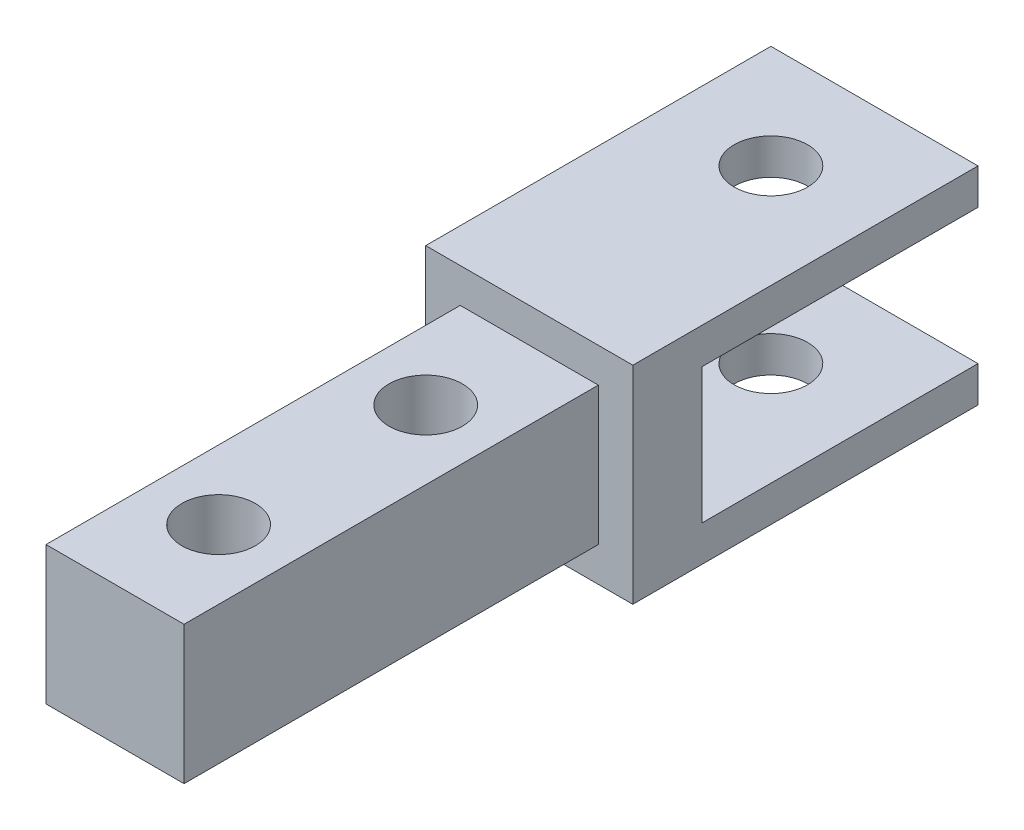
ISO-10303-21;
HEADER;
FILE_DESCRIPTION(('STEP AP214'),'2;1');
FILE_NAME('part.step','',(''),(''),'','','');
FILE_SCHEMA(('AUTOMOTIVE_DESIGN { 1 0 10303 214 1 1 1 1 }'));
ENDSEC;
DATA;
#1=APPLICATION_CONTEXT('core data for automotive mechanical design processes');
#2=APPLICATION_PROTOCOL_DEFINITION('international standard','automotive_design',2000,#1);
#3=PRODUCT_CONTEXT('',#1,'mechanical');
#4=PRODUCT('Part','Part','',(#3));
#5=PRODUCT_RELATED_PRODUCT_CATEGORY('part','',(#4));
#6=PRODUCT_DEFINITION_FORMATION('','',#4);
#7=PRODUCT_DEFINITION_CONTEXT('part definition',#1,'design');
#8=PRODUCT_DEFINITION('design','',#6,#7);
#9=PRODUCT_DEFINITION_SHAPE('','',#8);
#10=(LENGTH_UNIT() NAMED_UNIT(*) SI_UNIT(.MILLI.,.METRE.));
#11=(NAMED_UNIT(*) PLANE_ANGLE_UNIT() SI_UNIT($,.RADIAN.));
#12=(NAMED_UNIT(*) SI_UNIT($,.STERADIAN.) SOLID_ANGLE_UNIT());
#13=UNCERTAINTY_MEASURE_WITH_UNIT(LENGTH_MEASURE(1.E-05),#10,'distance_accuracy_value','');
#14=(GEOMETRIC_REPRESENTATION_CONTEXT(3) GLOBAL_UNCERTAINTY_ASSIGNED_CONTEXT((#13)) GLOBAL_UNIT_ASSIGNED_CONTEXT((#10,
#11,#12)) REPRESENTATION_CONTEXT('',''));
#15=CARTESIAN_POINT('',(0.,0.,0.));
#16=DIRECTION('',(0.,0.,1.));
#17=DIRECTION('',(1.,0.,0.));
#18=AXIS2_PLACEMENT_3D('',#15,#16,#17);
#19=CARTESIAN_POINT('',(0.,0.,-31.75));
#20=DIRECTION('',(0.,0.,-1.));
#21=DIRECTION('',(-1.,0.,0.));
#22=AXIS2_PLACEMENT_3D('',#19,#20,#21);
#23=PLANE('',#22);
#24=DIRECTION('',(-1.,0.,0.));
#25=VECTOR('',#24,1.);
#26=CARTESIAN_POINT('',(9.525,6.22300000000001,-31.75));
#27=LINE('',#26,#25);
#28=CARTESIAN_POINT('',(9.525,6.22300000000001,-31.75));
#29=VERTEX_POINT('',#28);
#30=CARTESIAN_POINT('',(-9.525,6.22300000000001,-31.75));
#31=VERTEX_POINT('',#30);
#32=EDGE_CURVE('E199',#29,#31,#27,.T.);
#33=ORIENTED_EDGE('',*,*,#32,.T.);
#34=DIRECTION('',(0.,-1.,0.));
#35=VECTOR('',#34,1.);
#36=CARTESIAN_POINT('',(-9.525,-9.525,-31.75));
#37=LINE('',#36,#35);
#38=CARTESIAN_POINT('',(-9.525,9.525,-31.75));
#39=VERTEX_POINT('',#38);
#40=EDGE_CURVE('E224',#39,#31,#37,.T.);
#41=ORIENTED_EDGE('',*,*,#40,.F.);
#42=DIRECTION('',(-1.,0.,0.));
#43=VECTOR('',#42,1.);
#44=CARTESIAN_POINT('',(-9.525,9.525,-31.75));
#45=LINE('',#44,#43);
#46=CARTESIAN_POINT('',(9.525,9.525,-31.75));
#47=VERTEX_POINT('',#46);
#48=EDGE_CURVE('E218',#47,#39,#45,.T.);
#49=ORIENTED_EDGE('',*,*,#48,.F.);
#50=DIRECTION('',(0.,1.,0.));
#51=VECTOR('',#50,1.);
#52=CARTESIAN_POINT('',(9.525,-9.525,-31.75));
#53=LINE('',#52,#51);
#54=EDGE_CURVE('E219',#29,#47,#53,.T.);
#55=ORIENTED_EDGE('',*,*,#54,.F.);
#56=EDGE_LOOP('',(#33,#41,#49,#55));
#57=FACE_BOUND('',#56,.T.);
#58=ADVANCED_FACE('F45',(#57),#23,.T.);
#59=CARTESIAN_POINT('',(-6.35,-6.35,38.1));
#60=DIRECTION('',(-1.,0.,0.));
#61=DIRECTION('',(0.,0.,1.));
#62=AXIS2_PLACEMENT_3D('',#59,#60,#61);
#63=PLANE('',#62);
#64=DIRECTION('',(0.,1.,0.));
#65=VECTOR('',#64,1.);
#66=CARTESIAN_POINT('',(-6.35,-6.35,0.));
#67=LINE('',#66,#65);
#68=CARTESIAN_POINT('',(-6.35,-6.35,0.));
#69=VERTEX_POINT('',#68);
#70=CARTESIAN_POINT('',(-6.35,6.35,0.));
#71=VERTEX_POINT('',#70);
#72=EDGE_CURVE('E91',#69,#71,#67,.T.);
#73=ORIENTED_EDGE('',*,*,#72,.F.);
#74=DIRECTION('',(0.,0.,-1.));
#75=VECTOR('',#74,1.);
#76=CARTESIAN_POINT('',(-6.35,-6.35,38.1));
#77=LINE('',#76,#75);
#78=CARTESIAN_POINT('',(-6.35,-6.35,38.1));
#79=VERTEX_POINT('',#78);
#80=EDGE_CURVE('E11',#79,#69,#77,.T.);
#81=ORIENTED_EDGE('',*,*,#80,.F.);
#82=DIRECTION('',(0.,1.,0.));
#83=VECTOR('',#82,1.);
#84=CARTESIAN_POINT('',(-6.35,-6.35,38.1));
#85=LINE('',#84,#83);
#86=CARTESIAN_POINT('',(-6.35,6.35,38.1));
#87=VERTEX_POINT('',#86);
#88=EDGE_CURVE('E122',#79,#87,#85,.T.);
#89=ORIENTED_EDGE('',*,*,#88,.T.);
#90=DIRECTION('',(0.,0.,-1.));
#91=VECTOR('',#90,1.);
#92=CARTESIAN_POINT('',(-6.35,6.35,38.1));
#93=LINE('',#92,#91);
#94=EDGE_CURVE('E118',#87,#71,#93,.T.);
#95=ORIENTED_EDGE('',*,*,#94,.T.);
#96=EDGE_LOOP('',(#73,#81,#89,#95));
#97=FACE_BOUND('',#96,.T.);
#98=ADVANCED_FACE('F47',(#97),#63,.T.);
#99=CARTESIAN_POINT('',(-6.35,-6.35,38.1));
#100=DIRECTION('',(0.,1.,0.));
#101=DIRECTION('',(0.,0.,1.));
#102=AXIS2_PLACEMENT_3D('',#99,#100,#101);
#103=PLANE('',#102);
#104=CARTESIAN_POINT('',(0.,-6.35,9.52500000000003));
#105=DIRECTION('',(0.,1.,0.));
#106=DIRECTION('',(0.,0.,1.));
#107=AXIS2_PLACEMENT_3D('',#104,#105,#106);
#108=CIRCLE('',#107,3.3782);
#109=CARTESIAN_POINT('',(0.,-6.35,12.9032));
#110=VERTEX_POINT('',#109);
#111=EDGE_CURVE('E150',#110,#110,#108,.T.);
#112=ORIENTED_EDGE('',*,*,#111,.T.);
#113=EDGE_LOOP('',(#112));
#114=FACE_BOUND('',#113,.T.);
#115=CARTESIAN_POINT('',(0.,-6.35,28.575));
#116=DIRECTION('',(0.,1.,0.));
#117=DIRECTION('',(0.,0.,1.));
#118=AXIS2_PLACEMENT_3D('',#115,#116,#117);
#119=CIRCLE('',#118,3.3782);
#120=CARTESIAN_POINT('',(0.,-6.35,31.9532));
#121=VERTEX_POINT('',#120);
#122=EDGE_CURVE('E149',#121,#121,#119,.T.);
#123=ORIENTED_EDGE('',*,*,#122,.T.);
#124=EDGE_LOOP('',(#123));
#125=FACE_BOUND('',#124,.T.);
#126=DIRECTION('',(1.,0.,0.));
#127=VECTOR('',#126,1.);
#128=CARTESIAN_POINT('',(-6.35,-6.35,0.));
#129=LINE('',#128,#127);
#130=CARTESIAN_POINT('',(6.35,-6.35,0.));
#131=VERTEX_POINT('',#130);
#132=EDGE_CURVE('E126',#69,#131,#129,.T.);
#133=ORIENTED_EDGE('',*,*,#132,.T.);
#134=DIRECTION('',(0.,0.,-1.));
#135=VECTOR('',#134,1.);
#136=CARTESIAN_POINT('',(6.35,-6.35,38.1));
#137=LINE('',#136,#135);
#138=CARTESIAN_POINT('',(6.35,-6.35,38.1));
#139=VERTEX_POINT('',#138);
#140=EDGE_CURVE('E55',#139,#131,#137,.T.);
#141=ORIENTED_EDGE('',*,*,#140,.F.);
#142=DIRECTION('',(1.,0.,0.));
#143=VECTOR('',#142,1.);
#144=CARTESIAN_POINT('',(-6.35,-6.35,38.1));
#145=LINE('',#144,#143);
#146=EDGE_CURVE('E106',#79,#139,#145,.T.);
#147=ORIENTED_EDGE('',*,*,#146,.F.);
#148=ORIENTED_EDGE('',*,*,#80,.T.);
#149=EDGE_LOOP('',(#133,#141,#147,#148));
#150=FACE_BOUND('',#149,.T.);
#151=ADVANCED_FACE('F364',(#114,#125,#150),#103,.F.);
#152=CARTESIAN_POINT('',(6.35,-6.35,38.1));
#153=DIRECTION('',(-1.,0.,0.));
#154=DIRECTION('',(0.,0.,1.));
#155=AXIS2_PLACEMENT_3D('',#152,#153,#154);
#156=PLANE('',#155);
#157=DIRECTION('',(0.,1.,0.));
#158=VECTOR('',#157,1.);
#159=CARTESIAN_POINT('',(6.35,-6.35,0.));
#160=LINE('',#159,#158);
#161=CARTESIAN_POINT('',(6.35,6.35,0.));
#162=VERTEX_POINT('',#161);
#163=EDGE_CURVE('E84',#131,#162,#160,.T.);
#164=ORIENTED_EDGE('',*,*,#163,.T.);
#165=DIRECTION('',(0.,0.,-1.));
#166=VECTOR('',#165,1.);
#167=CARTESIAN_POINT('',(6.35,6.35,38.1));
#168=LINE('',#167,#166);
#169=CARTESIAN_POINT('',(6.35,6.35,38.1));
#170=VERTEX_POINT('',#169);
#171=EDGE_CURVE('E113',#170,#162,#168,.T.);
#172=ORIENTED_EDGE('',*,*,#171,.F.);
#173=DIRECTION('',(0.,1.,0.));
#174=VECTOR('',#173,1.);
#175=CARTESIAN_POINT('',(6.35,-6.35,38.1));
#176=LINE('',#175,#174);
#177=EDGE_CURVE('E100',#139,#170,#176,.T.);
#178=ORIENTED_EDGE('',*,*,#177,.F.);
#179=ORIENTED_EDGE('',*,*,#140,.T.);
#180=EDGE_LOOP('',(#164,#172,#178,#179));
#181=FACE_BOUND('',#180,.T.);
#182=ADVANCED_FACE('F114',(#181),#156,.F.);
#183=CARTESIAN_POINT('',(-6.35,6.35,38.1));
#184=DIRECTION('',(0.,1.,0.));
#185=DIRECTION('',(0.,0.,1.));
#186=AXIS2_PLACEMENT_3D('',#183,#184,#185);
#187=PLANE('',#186);
#188=CARTESIAN_POINT('',(0.,6.35,9.52500000000003));
#189=DIRECTION('',(0.,1.,0.));
#190=DIRECTION('',(0.,0.,1.));
#191=AXIS2_PLACEMENT_3D('',#188,#189,#190);
#192=CIRCLE('',#191,3.3782);
#193=CARTESIAN_POINT('',(0.,6.35,12.9032));
#194=VERTEX_POINT('',#193);
#195=EDGE_CURVE('E151',#194,#194,#192,.T.);
#196=ORIENTED_EDGE('',*,*,#195,.F.);
#197=EDGE_LOOP('',(#196));
#198=FACE_BOUND('',#197,.T.);
#199=CARTESIAN_POINT('',(0.,6.35,28.575));
#200=DIRECTION('',(0.,1.,0.));
#201=DIRECTION('',(0.,0.,1.));
#202=AXIS2_PLACEMENT_3D('',#199,#200,#201);
#203=CIRCLE('',#202,3.3782);
#204=CARTESIAN_POINT('',(0.,6.35,31.9532));
#205=VERTEX_POINT('',#204);
#206=EDGE_CURVE('E146',#205,#205,#203,.T.);
#207=ORIENTED_EDGE('',*,*,#206,.F.);
#208=EDGE_LOOP('',(#207));
#209=FACE_BOUND('',#208,.T.);
#210=DIRECTION('',(1.,0.,0.));
#211=VECTOR('',#210,1.);
#212=CARTESIAN_POINT('',(-6.35,6.35,0.));
#213=LINE('',#212,#211);
#214=EDGE_CURVE('E134',#71,#162,#213,.T.);
#215=ORIENTED_EDGE('',*,*,#214,.F.);
#216=ORIENTED_EDGE('',*,*,#94,.F.);
#217=DIRECTION('',(1.,0.,0.));
#218=VECTOR('',#217,1.);
#219=CARTESIAN_POINT('',(-6.35,6.35,38.1));
#220=LINE('',#219,#218);
#221=EDGE_CURVE('E105',#87,#170,#220,.T.);
#222=ORIENTED_EDGE('',*,*,#221,.T.);
#223=ORIENTED_EDGE('',*,*,#171,.T.);
#224=EDGE_LOOP('',(#215,#216,#222,#223));
#225=FACE_BOUND('',#224,.T.);
#226=ADVANCED_FACE('F120',(#198,#209,#225),#187,.T.);
#227=CARTESIAN_POINT('',(0.,0.,38.1));
#228=DIRECTION('',(0.,0.,-1.));
#229=DIRECTION('',(-1.,0.,0.));
#230=AXIS2_PLACEMENT_3D('',#227,#228,#229);
#231=PLANE('',#230);
#232=ORIENTED_EDGE('',*,*,#88,.F.);
#233=ORIENTED_EDGE('',*,*,#146,.T.);
#234=ORIENTED_EDGE('',*,*,#177,.T.);
#235=ORIENTED_EDGE('',*,*,#221,.F.);
#236=EDGE_LOOP('',(#232,#233,#234,#235));
#237=FACE_BOUND('',#236,.T.);
#238=ADVANCED_FACE('F103',(#237),#231,.F.);
#239=CARTESIAN_POINT('',(0.,0.,0.));
#240=DIRECTION('',(0.,0.,-1.));
#241=DIRECTION('',(-1.,0.,0.));
#242=AXIS2_PLACEMENT_3D('',#239,#240,#241);
#243=PLANE('',#242);
#244=DIRECTION('',(0.,1.,0.));
#245=VECTOR('',#244,1.);
#246=CARTESIAN_POINT('',(9.525,-9.525,0.));
#247=LINE('',#246,#245);
#248=CARTESIAN_POINT('',(9.525,-9.525,0.));
#249=VERTEX_POINT('',#248);
#250=CARTESIAN_POINT('',(9.525,9.525,0.));
#251=VERTEX_POINT('',#250);
#252=EDGE_CURVE('E203',#249,#251,#247,.T.);
#253=ORIENTED_EDGE('',*,*,#252,.T.);
#254=DIRECTION('',(-1.,0.,0.));
#255=VECTOR('',#254,1.);
#256=CARTESIAN_POINT('',(-9.525,9.525,0.));
#257=LINE('',#256,#255);
#258=CARTESIAN_POINT('',(-9.525,9.525,0.));
#259=VERTEX_POINT('',#258);
#260=EDGE_CURVE('E236',#251,#259,#257,.T.);
#261=ORIENTED_EDGE('',*,*,#260,.T.);
#262=DIRECTION('',(0.,-1.,0.));
#263=VECTOR('',#262,1.);
#264=CARTESIAN_POINT('',(-9.525,-9.525,0.));
#265=LINE('',#264,#263);
#266=CARTESIAN_POINT('',(-9.525,-9.525,0.));
#267=VERTEX_POINT('',#266);
#268=EDGE_CURVE('E240',#259,#267,#265,.T.);
#269=ORIENTED_EDGE('',*,*,#268,.T.);
#270=DIRECTION('',(1.,0.,0.));
#271=VECTOR('',#270,1.);
#272=CARTESIAN_POINT('',(-9.525,-9.525,0.));
#273=LINE('',#272,#271);
#274=EDGE_CURVE('E244',#267,#249,#273,.T.);
#275=ORIENTED_EDGE('',*,*,#274,.T.);
#276=EDGE_LOOP('',(#253,#261,#269,#275));
#277=FACE_BOUND('',#276,.T.);
#278=ORIENTED_EDGE('',*,*,#132,.F.);
#279=ORIENTED_EDGE('',*,*,#72,.T.);
#280=ORIENTED_EDGE('',*,*,#214,.T.);
#281=ORIENTED_EDGE('',*,*,#163,.F.);
#282=EDGE_LOOP('',(#278,#279,#280,#281));
#283=FACE_BOUND('',#282,.T.);
#284=ADVANCED_FACE('F281',(#277,#283),#243,.F.);
#285=CARTESIAN_POINT('',(9.525,-9.525,-31.75));
#286=DIRECTION('',(1.,0.,0.));
#287=DIRECTION('',(0.,0.,-1.));
#288=AXIS2_PLACEMENT_3D('',#285,#286,#287);
#289=PLANE('',#288);
#290=DIRECTION('',(0.,0.,-1.));
#291=VECTOR('',#290,1.);
#292=CARTESIAN_POINT('',(9.525,6.22300000000001,-31.75));
#293=LINE('',#292,#291);
#294=CARTESIAN_POINT('',(9.525,6.22300000000001,-6.35));
#295=VERTEX_POINT('',#294);
#296=EDGE_CURVE('E184',#295,#29,#293,.T.);
#297=ORIENTED_EDGE('',*,*,#296,.T.);
#298=ORIENTED_EDGE('',*,*,#54,.T.);
#299=DIRECTION('',(0.,0.,1.));
#300=VECTOR('',#299,1.);
#301=CARTESIAN_POINT('',(9.525,9.525,-31.75));
#302=LINE('',#301,#300);
#303=EDGE_CURVE('E232',#47,#251,#302,.T.);
#304=ORIENTED_EDGE('',*,*,#303,.T.);
#305=ORIENTED_EDGE('',*,*,#252,.F.);
#306=DIRECTION('',(0.,0.,1.));
#307=VECTOR('',#306,1.);
#308=CARTESIAN_POINT('',(9.525,-9.525,-31.75));
#309=LINE('',#308,#307);
#310=CARTESIAN_POINT('',(9.525,-9.525,-31.75));
#311=VERTEX_POINT('',#310);
#312=EDGE_CURVE('E135',#311,#249,#309,.T.);
#313=ORIENTED_EDGE('',*,*,#312,.F.);
#314=CARTESIAN_POINT('',(9.525,-6.22300000000001,-31.75));
#315=VERTEX_POINT('',#314);
#316=EDGE_CURVE('E214',#311,#315,#53,.T.);
#317=ORIENTED_EDGE('',*,*,#316,.T.);
#318=DIRECTION('',(0.,0.,1.));
#319=VECTOR('',#318,1.);
#320=CARTESIAN_POINT('',(9.525,-6.22300000000001,-31.75));
#321=LINE('',#320,#319);
#322=CARTESIAN_POINT('',(9.525,-6.22299999999999,-6.35));
#323=VERTEX_POINT('',#322);
#324=EDGE_CURVE('E63',#315,#323,#321,.T.);
#325=ORIENTED_EDGE('',*,*,#324,.T.);
#326=DIRECTION('',(0.,1.,0.));
#327=VECTOR('',#326,1.);
#328=CARTESIAN_POINT('',(9.525,-6.22299999999999,-6.35));
#329=LINE('',#328,#327);
#330=EDGE_CURVE('E179',#323,#295,#329,.T.);
#331=ORIENTED_EDGE('',*,*,#330,.T.);
#332=EDGE_LOOP('',(#297,#298,#304,#305,#313,#317,#325,#331));
#333=FACE_BOUND('',#332,.T.);
#334=ADVANCED_FACE('F267',(#333),#289,.T.);
#335=CARTESIAN_POINT('',(-9.525,-9.525,-31.75));
#336=DIRECTION('',(0.,-1.,0.));
#337=DIRECTION('',(0.,0.,-1.));
#338=AXIS2_PLACEMENT_3D('',#335,#336,#337);
#339=PLANE('',#338);
#340=CARTESIAN_POINT('',(0.,-9.525,-22.225));
#341=DIRECTION('',(0.,-1.,0.));
#342=DIRECTION('',(0.,0.,-1.));
#343=AXIS2_PLACEMENT_3D('',#340,#341,#342);
#344=CIRCLE('',#343,3.3782);
#345=CARTESIAN_POINT('',(0.,-9.525,-25.6032));
#346=VERTEX_POINT('',#345);
#347=EDGE_CURVE('E169',#346,#346,#344,.F.);
#348=ORIENTED_EDGE('',*,*,#347,.T.);
#349=EDGE_LOOP('',(#348));
#350=FACE_BOUND('',#349,.T.);
#351=ORIENTED_EDGE('',*,*,#274,.F.);
#352=DIRECTION('',(0.,0.,1.));
#353=VECTOR('',#352,1.);
#354=CARTESIAN_POINT('',(-9.525,-9.525,-31.75));
#355=LINE('',#354,#353);
#356=CARTESIAN_POINT('',(-9.525,-9.525,-31.75));
#357=VERTEX_POINT('',#356);
#358=EDGE_CURVE('E251',#357,#267,#355,.T.);
#359=ORIENTED_EDGE('',*,*,#358,.F.);
#360=DIRECTION('',(1.,0.,0.));
#361=VECTOR('',#360,1.);
#362=CARTESIAN_POINT('',(-9.525,-9.525,-31.75));
#363=LINE('',#362,#361);
#364=EDGE_CURVE('E228',#357,#311,#363,.T.);
#365=ORIENTED_EDGE('',*,*,#364,.T.);
#366=ORIENTED_EDGE('',*,*,#312,.T.);
#367=EDGE_LOOP('',(#351,#359,#365,#366));
#368=FACE_BOUND('',#367,.T.);
#369=ADVANCED_FACE('F287',(#350,#368),#339,.T.);
#370=CARTESIAN_POINT('',(-9.525,-9.525,-31.75));
#371=DIRECTION('',(-1.,0.,0.));
#372=DIRECTION('',(0.,0.,1.));
#373=AXIS2_PLACEMENT_3D('',#370,#371,#372);
#374=PLANE('',#373);
#375=DIRECTION('',(0.,0.,-1.));
#376=VECTOR('',#375,1.);
#377=CARTESIAN_POINT('',(-9.525,6.22300000000001,-31.75));
#378=LINE('',#377,#376);
#379=CARTESIAN_POINT('',(-9.525,6.22300000000001,-6.35));
#380=VERTEX_POINT('',#379);
#381=EDGE_CURVE('E180',#380,#31,#378,.T.);
#382=ORIENTED_EDGE('',*,*,#381,.F.);
#383=DIRECTION('',(0.,1.,0.));
#384=VECTOR('',#383,1.);
#385=CARTESIAN_POINT('',(-9.525,-6.22299999999999,-6.35));
#386=LINE('',#385,#384);
#387=CARTESIAN_POINT('',(-9.525,-6.22299999999999,-6.35));
#388=VERTEX_POINT('',#387);
#389=EDGE_CURVE('E192',#388,#380,#386,.T.);
#390=ORIENTED_EDGE('',*,*,#389,.F.);
#391=DIRECTION('',(0.,0.,1.));
#392=VECTOR('',#391,1.);
#393=CARTESIAN_POINT('',(-9.525,-6.22300000000001,-31.75));
#394=LINE('',#393,#392);
#395=CARTESIAN_POINT('',(-9.525,-6.22300000000001,-31.75));
#396=VERTEX_POINT('',#395);
#397=EDGE_CURVE('E176',#396,#388,#394,.T.);
#398=ORIENTED_EDGE('',*,*,#397,.F.);
#399=EDGE_CURVE('E223',#396,#357,#37,.T.);
#400=ORIENTED_EDGE('',*,*,#399,.T.);
#401=ORIENTED_EDGE('',*,*,#358,.T.);
#402=ORIENTED_EDGE('',*,*,#268,.F.);
#403=DIRECTION('',(0.,0.,1.));
#404=VECTOR('',#403,1.);
#405=CARTESIAN_POINT('',(-9.525,9.525,-31.75));
#406=LINE('',#405,#404);
#407=EDGE_CURVE('E255',#39,#259,#406,.T.);
#408=ORIENTED_EDGE('',*,*,#407,.F.);
#409=ORIENTED_EDGE('',*,*,#40,.T.);
#410=EDGE_LOOP('',(#382,#390,#398,#400,#401,#402,#408,#409));
#411=FACE_BOUND('',#410,.T.);
#412=ADVANCED_FACE('F327',(#411),#374,.T.);
#413=CARTESIAN_POINT('',(-9.525,9.525,-31.75));
#414=DIRECTION('',(0.,1.,0.));
#415=DIRECTION('',(0.,0.,1.));
#416=AXIS2_PLACEMENT_3D('',#413,#414,#415);
#417=PLANE('',#416);
#418=CARTESIAN_POINT('',(0.,9.525,-22.225));
#419=DIRECTION('',(0.,1.,0.));
#420=DIRECTION('',(0.,0.,1.));
#421=AXIS2_PLACEMENT_3D('',#418,#419,#420);
#422=CIRCLE('',#421,3.3782);
#423=CARTESIAN_POINT('',(0.,9.525,-18.8468));
#424=VERTEX_POINT('',#423);
#425=EDGE_CURVE('E416',#424,#424,#422,.T.);
#426=ORIENTED_EDGE('',*,*,#425,.F.);
#427=EDGE_LOOP('',(#426));
#428=FACE_BOUND('',#427,.T.);
#429=ORIENTED_EDGE('',*,*,#260,.F.);
#430=ORIENTED_EDGE('',*,*,#303,.F.);
#431=ORIENTED_EDGE('',*,*,#48,.T.);
#432=ORIENTED_EDGE('',*,*,#407,.T.);
#433=EDGE_LOOP('',(#429,#430,#431,#432));
#434=FACE_BOUND('',#433,.T.);
#435=ADVANCED_FACE('F277',(#428,#434),#417,.T.);
#436=DIRECTION('',(-1.,0.,0.));
#437=VECTOR('',#436,1.);
#438=CARTESIAN_POINT('',(9.525,-6.22300000000001,-31.75));
#439=LINE('',#438,#437);
#440=EDGE_CURVE('E188',#315,#396,#439,.T.);
#441=ORIENTED_EDGE('',*,*,#440,.F.);
#442=ORIENTED_EDGE('',*,*,#316,.F.);
#443=ORIENTED_EDGE('',*,*,#364,.F.);
#444=ORIENTED_EDGE('',*,*,#399,.F.);
#445=EDGE_LOOP('',(#441,#442,#443,#444));
#446=FACE_BOUND('',#445,.T.);
#447=ADVANCED_FACE('F324',(#446),#23,.T.);
#448=CARTESIAN_POINT('',(9.525,6.22300000000001,-31.75));
#449=DIRECTION('',(0.,1.,0.));
#450=DIRECTION('',(0.,0.,1.));
#451=AXIS2_PLACEMENT_3D('',#448,#449,#450);
#452=PLANE('',#451);
#453=CARTESIAN_POINT('',(0.,6.22300000000001,-22.225));
#454=DIRECTION('',(0.,1.,0.));
#455=DIRECTION('',(0.,0.,1.));
#456=AXIS2_PLACEMENT_3D('',#453,#454,#455);
#457=CIRCLE('',#456,3.3782);
#458=CARTESIAN_POINT('',(0.,6.22300000000001,-18.8468));
#459=VERTEX_POINT('',#458);
#460=EDGE_CURVE('E154',#459,#459,#457,.T.);
#461=ORIENTED_EDGE('',*,*,#460,.T.);
#462=EDGE_LOOP('',(#461));
#463=FACE_BOUND('',#462,.T.);
#464=ORIENTED_EDGE('',*,*,#381,.T.);
#465=ORIENTED_EDGE('',*,*,#32,.F.);
#466=ORIENTED_EDGE('',*,*,#296,.F.);
#467=DIRECTION('',(-1.,0.,0.));
#468=VECTOR('',#467,1.);
#469=CARTESIAN_POINT('',(9.525,6.22300000000001,-6.35));
#470=LINE('',#469,#468);
#471=EDGE_CURVE('E204',#295,#380,#470,.T.);
#472=ORIENTED_EDGE('',*,*,#471,.T.);
#473=EDGE_LOOP('',(#464,#465,#466,#472));
#474=FACE_BOUND('',#473,.T.);
#475=ADVANCED_FACE('F330',(#463,#474),#452,.F.);
#476=CARTESIAN_POINT('',(9.525,-6.22299999999999,-6.35));
#477=DIRECTION('',(0.,0.,1.));
#478=DIRECTION('',(1.,0.,0.));
#479=AXIS2_PLACEMENT_3D('',#476,#477,#478);
#480=PLANE('',#479);
#481=ORIENTED_EDGE('',*,*,#389,.T.);
#482=ORIENTED_EDGE('',*,*,#471,.F.);
#483=ORIENTED_EDGE('',*,*,#330,.F.);
#484=DIRECTION('',(-1.,0.,0.));
#485=VECTOR('',#484,1.);
#486=CARTESIAN_POINT('',(9.525,-6.22299999999999,-6.35));
#487=LINE('',#486,#485);
#488=EDGE_CURVE('E208',#323,#388,#487,.T.);
#489=ORIENTED_EDGE('',*,*,#488,.T.);
#490=EDGE_LOOP('',(#481,#482,#483,#489));
#491=FACE_BOUND('',#490,.T.);
#492=ADVANCED_FACE('F321',(#491),#480,.F.);
#493=CARTESIAN_POINT('',(9.525,-6.22300000000001,-31.75));
#494=DIRECTION('',(0.,-1.,0.));
#495=DIRECTION('',(0.,0.,-1.));
#496=AXIS2_PLACEMENT_3D('',#493,#494,#495);
#497=PLANE('',#496);
#498=CARTESIAN_POINT('',(0.,-6.223,-22.225));
#499=DIRECTION('',(0.,-1.,0.));
#500=DIRECTION('',(0.,0.,-1.));
#501=AXIS2_PLACEMENT_3D('',#498,#499,#500);
#502=CIRCLE('',#501,3.3782);
#503=CARTESIAN_POINT('',(0.,-6.223,-25.6032));
#504=VERTEX_POINT('',#503);
#505=EDGE_CURVE('E49',#504,#504,#502,.T.);
#506=ORIENTED_EDGE('',*,*,#505,.T.);
#507=EDGE_LOOP('',(#506));
#508=FACE_BOUND('',#507,.T.);
#509=ORIENTED_EDGE('',*,*,#397,.T.);
#510=ORIENTED_EDGE('',*,*,#488,.F.);
#511=ORIENTED_EDGE('',*,*,#324,.F.);
#512=ORIENTED_EDGE('',*,*,#440,.T.);
#513=EDGE_LOOP('',(#509,#510,#511,#512));
#514=FACE_BOUND('',#513,.T.);
#515=ADVANCED_FACE('F317',(#508,#514),#497,.F.);
#516=CARTESIAN_POINT('',(0.,9.525,28.575));
#517=DIRECTION('',(0.,1.,0.));
#518=DIRECTION('',(0.,0.,1.));
#519=AXIS2_PLACEMENT_3D('',#516,#517,#518);
#520=CYLINDRICAL_SURFACE('',#519,3.3782);
#521=CARTESIAN_POINT('',(0.,6.35,31.9532));
#522=CARTESIAN_POINT('',(0.,6.21770833333333,31.9532));
#523=CARTESIAN_POINT('',(0.,6.08541666666667,31.9532));
#524=CARTESIAN_POINT('',(0.,5.82083333333333,31.9532));
#525=CARTESIAN_POINT('',(0.,5.68854166666667,31.9532));
#526=CARTESIAN_POINT('',(0.,5.42395833333333,31.9532));
#527=CARTESIAN_POINT('',(0.,5.29166666666667,31.9532));
#528=CARTESIAN_POINT('',(0.,5.02708333333333,31.9532));
#529=CARTESIAN_POINT('',(0.,4.89479166666667,31.9532));
#530=CARTESIAN_POINT('',(0.,4.63020833333333,31.9532));
#531=CARTESIAN_POINT('',(0.,4.49791666666667,31.9532));
#532=CARTESIAN_POINT('',(0.,4.23333333333333,31.9532));
#533=CARTESIAN_POINT('',(0.,4.10104166666667,31.9532));
#534=CARTESIAN_POINT('',(0.,3.83645833333333,31.9532));
#535=CARTESIAN_POINT('',(0.,3.70416666666667,31.9532));
#536=CARTESIAN_POINT('',(0.,3.43958333333333,31.9532));
#537=CARTESIAN_POINT('',(0.,3.30729166666667,31.9532));
#538=CARTESIAN_POINT('',(0.,3.04270833333333,31.9532));
#539=CARTESIAN_POINT('',(0.,2.91041666666667,31.9532));
#540=CARTESIAN_POINT('',(0.,2.64583333333333,31.9532));
#541=CARTESIAN_POINT('',(0.,2.51354166666667,31.9532));
#542=CARTESIAN_POINT('',(0.,2.24895833333333,31.9532));
#543=CARTESIAN_POINT('',(0.,2.11666666666667,31.9532));
#544=CARTESIAN_POINT('',(0.,1.85208333333333,31.9532));
#545=CARTESIAN_POINT('',(0.,1.71979166666667,31.9532));
#546=CARTESIAN_POINT('',(0.,1.45520833333333,31.9532));
#547=CARTESIAN_POINT('',(0.,1.32291666666667,31.9532));
#548=CARTESIAN_POINT('',(0.,1.05833333333333,31.9532));
#549=CARTESIAN_POINT('',(0.,0.926041666666666,31.9532));
#550=CARTESIAN_POINT('',(0.,0.661458333333332,31.9532));
#551=CARTESIAN_POINT('',(0.,0.529166666666665,31.9532));
#552=CARTESIAN_POINT('',(0.,0.264583333333332,31.9532));
#553=CARTESIAN_POINT('',(0.,0.132291666666666,31.9532));
#554=CARTESIAN_POINT('',(0.,-0.132291666666667,31.9532));
#555=CARTESIAN_POINT('',(0.,-0.264583333333334,31.9532));
#556=CARTESIAN_POINT('',(0.,-0.529166666666668,31.9532));
#557=CARTESIAN_POINT('',(0.,-0.661458333333334,31.9532));
#558=CARTESIAN_POINT('',(0.,-0.926041666666668,31.9532));
#559=CARTESIAN_POINT('',(0.,-1.05833333333333,31.9532));
#560=CARTESIAN_POINT('',(0.,-1.32291666666667,31.9532));
#561=CARTESIAN_POINT('',(0.,-1.45520833333333,31.9532));
#562=CARTESIAN_POINT('',(0.,-1.71979166666667,31.9532));
#563=CARTESIAN_POINT('',(0.,-1.85208333333333,31.9532));
#564=CARTESIAN_POINT('',(0.,-2.11666666666667,31.9532));
#565=CARTESIAN_POINT('',(0.,-2.24895833333333,31.9532));
#566=CARTESIAN_POINT('',(0.,-2.51354166666667,31.9532));
#567=CARTESIAN_POINT('',(0.,-2.64583333333333,31.9532));
#568=CARTESIAN_POINT('',(0.,-2.91041666666667,31.9532));
#569=CARTESIAN_POINT('',(0.,-3.04270833333333,31.9532));
#570=CARTESIAN_POINT('',(0.,-3.30729166666667,31.9532));
#571=CARTESIAN_POINT('',(0.,-3.43958333333333,31.9532));
#572=CARTESIAN_POINT('',(0.,-3.70416666666667,31.9532));
#573=CARTESIAN_POINT('',(0.,-3.83645833333333,31.9532));
#574=CARTESIAN_POINT('',(0.,-4.10104166666667,31.9532));
#575=CARTESIAN_POINT('',(0.,-4.23333333333333,31.9532));
#576=CARTESIAN_POINT('',(0.,-4.49791666666667,31.9532));
#577=CARTESIAN_POINT('',(0.,-4.63020833333333,31.9532));
#578=CARTESIAN_POINT('',(0.,-4.89479166666667,31.9532));
#579=CARTESIAN_POINT('',(0.,-5.02708333333333,31.9532));
#580=CARTESIAN_POINT('',(0.,-5.29166666666667,31.9532));
#581=CARTESIAN_POINT('',(0.,-5.42395833333333,31.9532));
#582=CARTESIAN_POINT('',(0.,-5.68854166666667,31.9532));
#583=CARTESIAN_POINT('',(0.,-5.82083333333333,31.9532));
#584=CARTESIAN_POINT('',(0.,-6.08541666666667,31.9532));
#585=CARTESIAN_POINT('',(0.,-6.21770833333333,31.9532));
#586=CARTESIAN_POINT('',(0.,-6.35,31.9532));
#587=B_SPLINE_CURVE_WITH_KNOTS('',3,(#521,#522,#523,#524,#525,#526,#527,#528,#529,#530,#531,
#532,#533,#534,#535,#536,#537,#538,#539,#540,#541,#542,#543,#544,#545,#546,#547,#548,#549,#550,
#551,#552,#553,#554,#555,#556,#557,#558,#559,#560,#561,#562,#563,#564,#565,#566,#567,#568,#569,
#570,#571,#572,#573,#574,#575,#576,#577,#578,#579,#580,#581,#582,#583,#584,#585,#586),
.UNSPECIFIED.,.F.,.F.,(4,2,2,2,2,2,2,2,2,2,2,2,2,2,2,2,2,2,2,2,2,2,2,2,2,2,2,2,2,2,2,2,4),(0.,
0.396875000000001,0.79375,1.190625,1.5875,1.984375,2.38125,2.778125,3.175,3.571875,3.96875,
4.365625,4.7625,5.159375,5.55625,5.953125,6.35,6.746875,7.14375,7.540625,7.9375,8.334375,
8.73125,9.128125,9.525,9.921875,10.31875,10.715625,11.1125,11.509375,11.90625,12.303125,12.7),.UNSPECIFIED.);
#588=EDGE_CURVE('BSEAM397',#205,#121,#587,.T.);
#589=ORIENTED_EDGE('',*,*,#206,.T.);
#590=ORIENTED_EDGE('',*,*,#122,.F.);
#591=ORIENTED_EDGE('',*,*,#588,.T.);
#592=ORIENTED_EDGE('',*,*,#588,.F.);
#593=EDGE_LOOP('',(#589,#591,#590,#592));
#594=FACE_BOUND('',#593,.T.);
#595=ADVANCED_FACE('F397',(#594),#520,.F.);
#596=CARTESIAN_POINT('',(0.,9.525,9.52500000000003));
#597=DIRECTION('',(0.,1.,0.));
#598=DIRECTION('',(0.,0.,1.));
#599=AXIS2_PLACEMENT_3D('',#596,#597,#598);
#600=CYLINDRICAL_SURFACE('',#599,3.3782);
#601=CARTESIAN_POINT('',(0.,6.35,12.9032));
#602=CARTESIAN_POINT('',(0.,6.21770833333333,12.9032));
#603=CARTESIAN_POINT('',(0.,6.08541666666667,12.9032));
#604=CARTESIAN_POINT('',(0.,5.82083333333333,12.9032));
#605=CARTESIAN_POINT('',(0.,5.68854166666667,12.9032));
#606=CARTESIAN_POINT('',(0.,5.42395833333333,12.9032));
#607=CARTESIAN_POINT('',(0.,5.29166666666667,12.9032));
#608=CARTESIAN_POINT('',(0.,5.02708333333333,12.9032));
#609=CARTESIAN_POINT('',(0.,4.89479166666667,12.9032));
#610=CARTESIAN_POINT('',(0.,4.63020833333333,12.9032));
#611=CARTESIAN_POINT('',(0.,4.49791666666667,12.9032));
#612=CARTESIAN_POINT('',(0.,4.23333333333333,12.9032));
#613=CARTESIAN_POINT('',(0.,4.10104166666667,12.9032));
#614=CARTESIAN_POINT('',(0.,3.83645833333333,12.9032));
#615=CARTESIAN_POINT('',(0.,3.70416666666667,12.9032));
#616=CARTESIAN_POINT('',(0.,3.43958333333333,12.9032));
#617=CARTESIAN_POINT('',(0.,3.30729166666667,12.9032));
#618=CARTESIAN_POINT('',(0.,3.04270833333333,12.9032));
#619=CARTESIAN_POINT('',(0.,2.91041666666667,12.9032));
#620=CARTESIAN_POINT('',(0.,2.64583333333333,12.9032));
#621=CARTESIAN_POINT('',(0.,2.51354166666667,12.9032));
#622=CARTESIAN_POINT('',(0.,2.24895833333333,12.9032));
#623=CARTESIAN_POINT('',(0.,2.11666666666667,12.9032));
#624=CARTESIAN_POINT('',(0.,1.85208333333333,12.9032));
#625=CARTESIAN_POINT('',(0.,1.71979166666667,12.9032));
#626=CARTESIAN_POINT('',(0.,1.45520833333333,12.9032));
#627=CARTESIAN_POINT('',(0.,1.32291666666667,12.9032));
#628=CARTESIAN_POINT('',(0.,1.05833333333333,12.9032));
#629=CARTESIAN_POINT('',(0.,0.926041666666666,12.9032));
#630=CARTESIAN_POINT('',(0.,0.661458333333332,12.9032));
#631=CARTESIAN_POINT('',(0.,0.529166666666665,12.9032));
#632=CARTESIAN_POINT('',(0.,0.264583333333332,12.9032));
#633=CARTESIAN_POINT('',(0.,0.132291666666666,12.9032));
#634=CARTESIAN_POINT('',(0.,-0.132291666666667,12.9032));
#635=CARTESIAN_POINT('',(0.,-0.264583333333334,12.9032));
#636=CARTESIAN_POINT('',(0.,-0.529166666666668,12.9032));
#637=CARTESIAN_POINT('',(0.,-0.661458333333334,12.9032));
#638=CARTESIAN_POINT('',(0.,-0.926041666666668,12.9032));
#639=CARTESIAN_POINT('',(0.,-1.05833333333333,12.9032));
#640=CARTESIAN_POINT('',(0.,-1.32291666666667,12.9032));
#641=CARTESIAN_POINT('',(0.,-1.45520833333333,12.9032));
#642=CARTESIAN_POINT('',(0.,-1.71979166666667,12.9032));
#643=CARTESIAN_POINT('',(0.,-1.85208333333333,12.9032));
#644=CARTESIAN_POINT('',(0.,-2.11666666666667,12.9032));
#645=CARTESIAN_POINT('',(0.,-2.24895833333333,12.9032));
#646=CARTESIAN_POINT('',(0.,-2.51354166666667,12.9032));
#647=CARTESIAN_POINT('',(0.,-2.64583333333333,12.9032));
#648=CARTESIAN_POINT('',(0.,-2.91041666666667,12.9032));
#649=CARTESIAN_POINT('',(0.,-3.04270833333333,12.9032));
#650=CARTESIAN_POINT('',(0.,-3.30729166666667,12.9032));
#651=CARTESIAN_POINT('',(0.,-3.43958333333333,12.9032));
#652=CARTESIAN_POINT('',(0.,-3.70416666666667,12.9032));
#653=CARTESIAN_POINT('',(0.,-3.83645833333333,12.9032));
#654=CARTESIAN_POINT('',(0.,-4.10104166666667,12.9032));
#655=CARTESIAN_POINT('',(0.,-4.23333333333333,12.9032));
#656=CARTESIAN_POINT('',(0.,-4.49791666666667,12.9032));
#657=CARTESIAN_POINT('',(0.,-4.63020833333333,12.9032));
#658=CARTESIAN_POINT('',(0.,-4.89479166666667,12.9032));
#659=CARTESIAN_POINT('',(0.,-5.02708333333333,12.9032));
#660=CARTESIAN_POINT('',(0.,-5.29166666666667,12.9032));
#661=CARTESIAN_POINT('',(0.,-5.42395833333333,12.9032));
#662=CARTESIAN_POINT('',(0.,-5.68854166666667,12.9032));
#663=CARTESIAN_POINT('',(0.,-5.82083333333333,12.9032));
#664=CARTESIAN_POINT('',(0.,-6.08541666666667,12.9032));
#665=CARTESIAN_POINT('',(0.,-6.21770833333333,12.9032));
#666=CARTESIAN_POINT('',(0.,-6.35,12.9032));
#667=B_SPLINE_CURVE_WITH_KNOTS('',3,(#601,#602,#603,#604,#605,#606,#607,#608,#609,#610,#611,
#612,#613,#614,#615,#616,#617,#618,#619,#620,#621,#622,#623,#624,#625,#626,#627,#628,#629,#630,
#631,#632,#633,#634,#635,#636,#637,#638,#639,#640,#641,#642,#643,#644,#645,#646,#647,#648,#649,
#650,#651,#652,#653,#654,#655,#656,#657,#658,#659,#660,#661,#662,#663,#664,#665,#666),
.UNSPECIFIED.,.F.,.F.,(4,2,2,2,2,2,2,2,2,2,2,2,2,2,2,2,2,2,2,2,2,2,2,2,2,2,2,2,2,2,2,2,4),(0.,
0.396875000000001,0.79375,1.190625,1.5875,1.984375,2.38125,2.778125,3.175,3.571875,3.96875,
4.365625,4.7625,5.159375,5.55625,5.953125,6.35,6.746875,7.14375,7.540625,7.9375,8.334375,
8.73125,9.128125,9.525,9.921875,10.31875,10.715625,11.1125,11.509375,11.90625,12.303125,12.7),.UNSPECIFIED.);
#668=EDGE_CURVE('BSEAM400',#194,#110,#667,.T.);
#669=ORIENTED_EDGE('',*,*,#195,.T.);
#670=ORIENTED_EDGE('',*,*,#111,.F.);
#671=ORIENTED_EDGE('',*,*,#668,.T.);
#672=ORIENTED_EDGE('',*,*,#668,.F.);
#673=EDGE_LOOP('',(#669,#671,#670,#672));
#674=FACE_BOUND('',#673,.T.);
#675=ADVANCED_FACE('F400',(#674),#600,.F.);
#676=CARTESIAN_POINT('',(0.,9.525,-22.225));
#677=DIRECTION('',(0.,1.,0.));
#678=DIRECTION('',(0.,0.,1.));
#679=AXIS2_PLACEMENT_3D('',#676,#677,#678);
#680=CYLINDRICAL_SURFACE('',#679,3.3782);
#681=ORIENTED_EDGE('',*,*,#347,.F.);
#682=EDGE_LOOP('',(#681));
#683=FACE_BOUND('',#682,.T.);
#684=ORIENTED_EDGE('',*,*,#505,.F.);
#685=EDGE_LOOP('',(#684));
#686=FACE_BOUND('',#685,.T.);
#687=ADVANCED_FACE('F425',(#683,#686),#680,.F.);
#688=ORIENTED_EDGE('',*,*,#425,.T.);
#689=EDGE_LOOP('',(#688));
#690=FACE_BOUND('',#689,.T.);
#691=ORIENTED_EDGE('',*,*,#460,.F.);
#692=EDGE_LOOP('',(#691));
#693=FACE_BOUND('',#692,.T.);
#694=ADVANCED_FACE('F422',(#690,#693),#680,.F.);
#695=CLOSED_SHELL('',(#58,#98,#151,#182,#226,#238,#284,#334,#369,#412,#435,#447,#475,#492,#515,
#595,#675,#687,#694));
#696=MANIFOLD_SOLID_BREP('B2',#695);
#697=ADVANCED_BREP_SHAPE_REPRESENTATION('',(#18,#696),#14);
#698=SHAPE_DEFINITION_REPRESENTATION(#9,#697);
ENDSEC;
END-ISO-10303-21;
